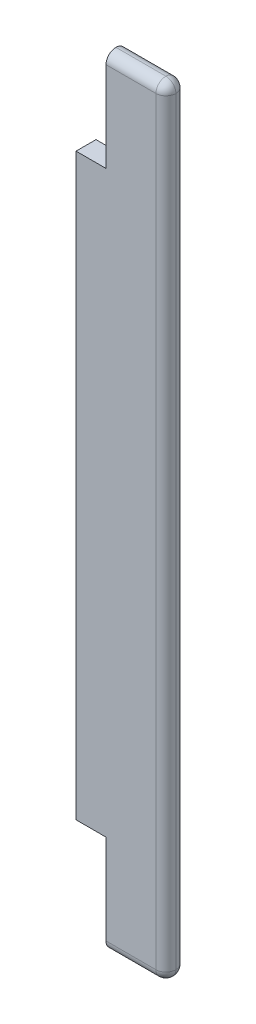
ISO-10303-21;
HEADER;
FILE_DESCRIPTION(('STEP AP214'),'2;1');
FILE_NAME('part.step','',(''),(''),'','','');
FILE_SCHEMA(('AUTOMOTIVE_DESIGN { 1 0 10303 214 1 1 1 1 }'));
ENDSEC;
DATA;
#1=APPLICATION_CONTEXT('core data for automotive mechanical design processes');
#2=APPLICATION_PROTOCOL_DEFINITION('international standard','automotive_design',2000,#1);
#3=PRODUCT_CONTEXT('',#1,'mechanical');
#4=PRODUCT('Part','Part','',(#3));
#5=PRODUCT_RELATED_PRODUCT_CATEGORY('part','',(#4));
#6=PRODUCT_DEFINITION_FORMATION('','',#4);
#7=PRODUCT_DEFINITION_CONTEXT('part definition',#1,'design');
#8=PRODUCT_DEFINITION('design','',#6,#7);
#9=PRODUCT_DEFINITION_SHAPE('','',#8);
#10=(LENGTH_UNIT() NAMED_UNIT(*) SI_UNIT(.MILLI.,.METRE.));
#11=(NAMED_UNIT(*) PLANE_ANGLE_UNIT() SI_UNIT($,.RADIAN.));
#12=(NAMED_UNIT(*) SI_UNIT($,.STERADIAN.) SOLID_ANGLE_UNIT());
#13=UNCERTAINTY_MEASURE_WITH_UNIT(LENGTH_MEASURE(1.E-05),#10,'distance_accuracy_value','');
#14=(GEOMETRIC_REPRESENTATION_CONTEXT(3) GLOBAL_UNCERTAINTY_ASSIGNED_CONTEXT((#13)) GLOBAL_UNIT_ASSIGNED_CONTEXT((#10,
#11,#12)) REPRESENTATION_CONTEXT('',''));
#15=CARTESIAN_POINT('',(0.,0.,0.));
#16=DIRECTION('',(0.,0.,1.));
#17=DIRECTION('',(1.,0.,0.));
#18=AXIS2_PLACEMENT_3D('',#15,#16,#17);
#19=CARTESIAN_POINT('',(-25.0000000000015,-120.172625831746,10.));
#20=DIRECTION('',(0.,1.,0.));
#21=DIRECTION('',(0.,0.,1.));
#22=AXIS2_PLACEMENT_3D('',#19,#20,#21);
#23=PLANE('',#22);
#24=DIRECTION('',(1.,0.,0.));
#25=VECTOR('',#24,1.);
#26=CARTESIAN_POINT('',(-25.0000000000015,-120.172625831746,0.));
#27=LINE('',#26,#25);
#28=CARTESIAN_POINT('',(-40.0000000000015,-120.172625831746,0.));
#29=VERTEX_POINT('',#28);
#30=CARTESIAN_POINT('',(-25.0000000000015,-120.172625831746,0.));
#31=VERTEX_POINT('',#30);
#32=EDGE_CURVE('E140',#29,#31,#27,.T.);
#33=ORIENTED_EDGE('',*,*,#32,.T.);
#34=DIRECTION('',(0.,0.,-1.));
#35=VECTOR('',#34,1.);
#36=CARTESIAN_POINT('',(-25.0000000000015,-120.172625831746,10.));
#37=LINE('',#36,#35);
#38=CARTESIAN_POINT('',(-25.0000000000015,-120.172625831746,10.));
#39=VERTEX_POINT('',#38);
#40=EDGE_CURVE('E120',#39,#31,#37,.T.);
#41=ORIENTED_EDGE('',*,*,#40,.F.);
#42=DIRECTION('',(1.,0.,0.));
#43=VECTOR('',#42,1.);
#44=CARTESIAN_POINT('',(-25.0000000000015,-120.172625831746,10.));
#45=LINE('',#44,#43);
#46=CARTESIAN_POINT('',(-40.0000000000015,-120.172625831746,10.));
#47=VERTEX_POINT('',#46);
#48=EDGE_CURVE('E127',#47,#39,#45,.T.);
#49=ORIENTED_EDGE('',*,*,#48,.F.);
#50=DIRECTION('',(0.,0.,-1.));
#51=VECTOR('',#50,1.);
#52=CARTESIAN_POINT('',(-40.0000000000015,-120.172625831746,10.));
#53=LINE('',#52,#51);
#54=EDGE_CURVE('E214',#47,#29,#53,.T.);
#55=ORIENTED_EDGE('',*,*,#54,.T.);
#56=EDGE_LOOP('',(#33,#41,#49,#55));
#57=FACE_BOUND('',#56,.T.);
#58=ADVANCED_FACE('F35',(#57),#23,.F.);
#59=CARTESIAN_POINT('',(-25.0000000000015,-170.172625831746,10.));
#60=DIRECTION('',(1.,0.,0.));
#61=DIRECTION('',(0.,0.,-1.));
#62=AXIS2_PLACEMENT_3D('',#59,#60,#61);
#63=PLANE('',#62);
#64=DIRECTION('',(0.,-1.,0.));
#65=VECTOR('',#64,1.);
#66=CARTESIAN_POINT('',(-25.0000000000015,-170.172625831746,0.));
#67=LINE('',#66,#65);
#68=CARTESIAN_POINT('',(-25.0000000000015,-165.172625831746,0.));
#69=VERTEX_POINT('',#68);
#70=EDGE_CURVE('E216',#31,#69,#67,.T.);
#71=ORIENTED_EDGE('',*,*,#70,.T.);
#72=CARTESIAN_POINT('',(-25.0000000000015,-165.172625831746,5.));
#73=DIRECTION('',(1.,0.,0.));
#74=DIRECTION('',(0.,0.,-1.));
#75=AXIS2_PLACEMENT_3D('',#72,#73,#74);
#76=CIRCLE('',#75,5.);
#77=CARTESIAN_POINT('',(-25.0000000000015,-170.172625831746,5.));
#78=VERTEX_POINT('',#77);
#79=EDGE_CURVE('E164',#69,#78,#76,.F.);
#80=ORIENTED_EDGE('',*,*,#79,.T.);
#81=CARTESIAN_POINT('',(-25.0000000000015,-165.172625831746,5.));
#82=DIRECTION('',(1.,0.,0.));
#83=DIRECTION('',(0.,0.,-1.));
#84=AXIS2_PLACEMENT_3D('',#81,#82,#83);
#85=CIRCLE('',#84,5.);
#86=CARTESIAN_POINT('',(-25.0000000000015,-165.172625831746,10.));
#87=VERTEX_POINT('',#86);
#88=EDGE_CURVE('E123',#78,#87,#85,.F.);
#89=ORIENTED_EDGE('',*,*,#88,.T.);
#90=DIRECTION('',(0.,-1.,0.));
#91=VECTOR('',#90,1.);
#92=CARTESIAN_POINT('',(-25.0000000000015,-170.172625831746,10.));
#93=LINE('',#92,#91);
#94=EDGE_CURVE('E115',#39,#87,#93,.T.);
#95=ORIENTED_EDGE('',*,*,#94,.F.);
#96=ORIENTED_EDGE('',*,*,#40,.T.);
#97=EDGE_LOOP('',(#71,#80,#89,#95,#96));
#98=FACE_BOUND('',#97,.T.);
#99=ADVANCED_FACE('F118',(#98),#63,.F.);
#100=CARTESIAN_POINT('',(-25.0000000000015,169.827374168254,10.));
#101=DIRECTION('',(1.,0.,0.));
#102=DIRECTION('',(0.,0.,-1.));
#103=AXIS2_PLACEMENT_3D('',#100,#101,#102);
#104=PLANE('',#103);
#105=CARTESIAN_POINT('',(-25.0000000000015,214.827374168254,5.));
#106=DIRECTION('',(1.,0.,0.));
#107=DIRECTION('',(0.,0.,-1.));
#108=AXIS2_PLACEMENT_3D('',#105,#106,#107);
#109=CIRCLE('',#108,5.);
#110=CARTESIAN_POINT('',(-25.0000000000015,214.827374168254,10.));
#111=VERTEX_POINT('',#110);
#112=CARTESIAN_POINT('',(-25.0000000000015,219.827374168254,5.));
#113=VERTEX_POINT('',#112);
#114=EDGE_CURVE('E53',#111,#113,#109,.F.);
#115=ORIENTED_EDGE('',*,*,#114,.T.);
#116=CARTESIAN_POINT('',(-25.0000000000015,214.827374168254,5.));
#117=DIRECTION('',(1.,0.,0.));
#118=DIRECTION('',(0.,0.,-1.));
#119=AXIS2_PLACEMENT_3D('',#116,#117,#118);
#120=CIRCLE('',#119,5.);
#121=CARTESIAN_POINT('',(-25.0000000000015,214.827374168254,0.));
#122=VERTEX_POINT('',#121);
#123=EDGE_CURVE('E185',#113,#122,#120,.F.);
#124=ORIENTED_EDGE('',*,*,#123,.T.);
#125=DIRECTION('',(0.,-1.,0.));
#126=VECTOR('',#125,1.);
#127=CARTESIAN_POINT('',(-25.0000000000015,169.827374168254,0.));
#128=LINE('',#127,#126);
#129=CARTESIAN_POINT('',(-25.0000000000015,169.827374168254,0.));
#130=VERTEX_POINT('',#129);
#131=EDGE_CURVE('E218',#122,#130,#128,.T.);
#132=ORIENTED_EDGE('',*,*,#131,.T.);
#133=DIRECTION('',(0.,0.,-1.));
#134=VECTOR('',#133,1.);
#135=CARTESIAN_POINT('',(-25.0000000000015,169.827374168254,10.));
#136=LINE('',#135,#134);
#137=CARTESIAN_POINT('',(-25.0000000000015,169.827374168254,10.));
#138=VERTEX_POINT('',#137);
#139=EDGE_CURVE('E142',#138,#130,#136,.T.);
#140=ORIENTED_EDGE('',*,*,#139,.F.);
#141=DIRECTION('',(0.,-1.,0.));
#142=VECTOR('',#141,1.);
#143=CARTESIAN_POINT('',(-25.0000000000015,169.827374168254,10.));
#144=LINE('',#143,#142);
#145=EDGE_CURVE('E126',#111,#138,#144,.T.);
#146=ORIENTED_EDGE('',*,*,#145,.F.);
#147=EDGE_LOOP('',(#115,#124,#132,#140,#146));
#148=FACE_BOUND('',#147,.T.);
#149=ADVANCED_FACE('F207',(#148),#104,.F.);
#150=CARTESIAN_POINT('',(-40.0000000000015,169.827374168254,10.));
#151=DIRECTION('',(0.,-1.,0.));
#152=DIRECTION('',(0.,0.,-1.));
#153=AXIS2_PLACEMENT_3D('',#150,#151,#152);
#154=PLANE('',#153);
#155=DIRECTION('',(-1.,0.,0.));
#156=VECTOR('',#155,1.);
#157=CARTESIAN_POINT('',(-40.0000000000015,169.827374168254,0.));
#158=LINE('',#157,#156);
#159=CARTESIAN_POINT('',(-40.0000000000015,169.827374168254,0.));
#160=VERTEX_POINT('',#159);
#161=EDGE_CURVE('E220',#130,#160,#158,.T.);
#162=ORIENTED_EDGE('',*,*,#161,.T.);
#163=DIRECTION('',(0.,0.,-1.));
#164=VECTOR('',#163,1.);
#165=CARTESIAN_POINT('',(-40.0000000000015,169.827374168254,10.));
#166=LINE('',#165,#164);
#167=CARTESIAN_POINT('',(-40.0000000000015,169.827374168254,10.));
#168=VERTEX_POINT('',#167);
#169=EDGE_CURVE('E147',#168,#160,#166,.T.);
#170=ORIENTED_EDGE('',*,*,#169,.F.);
#171=DIRECTION('',(-1.,0.,0.));
#172=VECTOR('',#171,1.);
#173=CARTESIAN_POINT('',(-40.0000000000015,169.827374168254,10.));
#174=LINE('',#173,#172);
#175=EDGE_CURVE('E209',#138,#168,#174,.T.);
#176=ORIENTED_EDGE('',*,*,#175,.F.);
#177=ORIENTED_EDGE('',*,*,#139,.T.);
#178=EDGE_LOOP('',(#162,#170,#176,#177));
#179=FACE_BOUND('',#178,.T.);
#180=ADVANCED_FACE('F284',(#179),#154,.F.);
#181=CARTESIAN_POINT('',(-40.0000000000015,-120.172625831746,10.));
#182=DIRECTION('',(1.,0.,0.));
#183=DIRECTION('',(0.,0.,-1.));
#184=AXIS2_PLACEMENT_3D('',#181,#182,#183);
#185=PLANE('',#184);
#186=DIRECTION('',(0.,-1.,0.));
#187=VECTOR('',#186,1.);
#188=CARTESIAN_POINT('',(-40.0000000000015,-120.172625831746,0.));
#189=LINE('',#188,#187);
#190=EDGE_CURVE('E137',#160,#29,#189,.T.);
#191=ORIENTED_EDGE('',*,*,#190,.T.);
#192=ORIENTED_EDGE('',*,*,#54,.F.);
#193=DIRECTION('',(0.,-1.,0.));
#194=VECTOR('',#193,1.);
#195=CARTESIAN_POINT('',(-40.0000000000015,-120.172625831746,10.));
#196=LINE('',#195,#194);
#197=EDGE_CURVE('E133',#168,#47,#196,.T.);
#198=ORIENTED_EDGE('',*,*,#197,.F.);
#199=ORIENTED_EDGE('',*,*,#169,.T.);
#200=EDGE_LOOP('',(#191,#192,#198,#199));
#201=FACE_BOUND('',#200,.T.);
#202=ADVANCED_FACE('F227',(#201),#185,.F.);
#203=CARTESIAN_POINT('',(0.,0.,10.));
#204=DIRECTION('',(0.,0.,-1.));
#205=DIRECTION('',(-1.,0.,0.));
#206=AXIS2_PLACEMENT_3D('',#203,#204,#205);
#207=PLANE('',#206);
#208=DIRECTION('',(0.,1.,0.));
#209=VECTOR('',#208,1.);
#210=CARTESIAN_POINT('',(-1.47278023110431E-12,0.,10.));
#211=LINE('',#210,#209);
#212=CARTESIAN_POINT('',(-1.47278023110431E-12,-165.172625831746,10.));
#213=VERTEX_POINT('',#212);
#214=CARTESIAN_POINT('',(-1.47278023110431E-12,214.827374168254,10.));
#215=VERTEX_POINT('',#214);
#216=EDGE_CURVE('E141',#213,#215,#211,.T.);
#217=ORIENTED_EDGE('',*,*,#216,.T.);
#218=DIRECTION('',(-1.,0.,0.));
#219=VECTOR('',#218,1.);
#220=CARTESIAN_POINT('',(0.,214.827374168254,10.));
#221=LINE('',#220,#219);
#222=EDGE_CURVE('E11',#215,#111,#221,.T.);
#223=ORIENTED_EDGE('',*,*,#222,.T.);
#224=ORIENTED_EDGE('',*,*,#145,.T.);
#225=ORIENTED_EDGE('',*,*,#175,.T.);
#226=ORIENTED_EDGE('',*,*,#197,.T.);
#227=ORIENTED_EDGE('',*,*,#48,.T.);
#228=ORIENTED_EDGE('',*,*,#94,.T.);
#229=DIRECTION('',(1.,0.,0.));
#230=VECTOR('',#229,1.);
#231=CARTESIAN_POINT('',(0.,-165.172625831746,10.));
#232=LINE('',#231,#230);
#233=EDGE_CURVE('E166',#87,#213,#232,.T.);
#234=ORIENTED_EDGE('',*,*,#233,.T.);
#235=EDGE_LOOP('',(#217,#223,#224,#225,#226,#227,#228,#234));
#236=FACE_BOUND('',#235,.T.);
#237=ADVANCED_FACE('F131',(#236),#207,.F.);
#238=CARTESIAN_POINT('',(0.,0.,0.));
#239=DIRECTION('',(0.,0.,-1.));
#240=DIRECTION('',(-1.,0.,0.));
#241=AXIS2_PLACEMENT_3D('',#238,#239,#240);
#242=PLANE('',#241);
#243=ORIENTED_EDGE('',*,*,#131,.F.);
#244=DIRECTION('',(-1.,0.,0.));
#245=VECTOR('',#244,1.);
#246=CARTESIAN_POINT('',(-1.47104550762833E-12,214.827374168254,0.));
#247=LINE('',#246,#245);
#248=CARTESIAN_POINT('',(-1.47278023110431E-12,214.827374168254,0.));
#249=VERTEX_POINT('',#248);
#250=EDGE_CURVE('E45',#122,#249,#247,.F.);
#251=ORIENTED_EDGE('',*,*,#250,.T.);
#252=DIRECTION('',(0.,1.,0.));
#253=VECTOR('',#252,1.);
#254=CARTESIAN_POINT('',(-1.47278023110431E-12,-170.172625831746,0.));
#255=LINE('',#254,#253);
#256=CARTESIAN_POINT('',(-1.47278023110431E-12,-165.172625831746,0.));
#257=VERTEX_POINT('',#256);
#258=EDGE_CURVE('E144',#249,#257,#255,.F.);
#259=ORIENTED_EDGE('',*,*,#258,.T.);
#260=DIRECTION('',(1.,0.,0.));
#261=VECTOR('',#260,1.);
#262=CARTESIAN_POINT('',(-25.0000000000015,-165.172625831746,0.));
#263=LINE('',#262,#261);
#264=EDGE_CURVE('E161',#257,#69,#263,.F.);
#265=ORIENTED_EDGE('',*,*,#264,.T.);
#266=ORIENTED_EDGE('',*,*,#70,.F.);
#267=ORIENTED_EDGE('',*,*,#32,.F.);
#268=ORIENTED_EDGE('',*,*,#190,.F.);
#269=ORIENTED_EDGE('',*,*,#161,.F.);
#270=EDGE_LOOP('',(#243,#251,#259,#265,#266,#267,#268,#269));
#271=FACE_BOUND('',#270,.T.);
#272=ADVANCED_FACE('F232',(#271),#242,.T.);
#273=CARTESIAN_POINT('',(-1.47278023110431E-12,0.,5.));
#274=DIRECTION('',(0.,1.,0.));
#275=DIRECTION('',(0.,0.,1.));
#276=AXIS2_PLACEMENT_3D('',#273,#274,#275);
#277=CYLINDRICAL_SURFACE('',#276,5.);
#278=DIRECTION('',(0.,1.,0.));
#279=VECTOR('',#278,1.);
#280=CARTESIAN_POINT('',(4.99999999999853,219.827374168254,5.));
#281=LINE('',#280,#279);
#282=CARTESIAN_POINT('',(4.99999999999853,214.827374168254,5.));
#283=VERTEX_POINT('',#282);
#284=CARTESIAN_POINT('',(4.99999999999853,-165.172625831746,5.));
#285=VERTEX_POINT('',#284);
#286=EDGE_CURVE('E153',#283,#285,#281,.F.);
#287=ORIENTED_EDGE('',*,*,#286,.F.);
#288=CARTESIAN_POINT('',(-1.47278023110431E-12,214.827374168254,5.));
#289=DIRECTION('',(0.,1.,0.));
#290=DIRECTION('',(0.,0.,1.));
#291=AXIS2_PLACEMENT_3D('',#288,#289,#290);
#292=CIRCLE('',#291,5.);
#293=EDGE_CURVE('E182',#283,#215,#292,.F.);
#294=ORIENTED_EDGE('',*,*,#293,.T.);
#295=ORIENTED_EDGE('',*,*,#216,.F.);
#296=CARTESIAN_POINT('',(-1.47278023110431E-12,-165.172625831746,5.));
#297=DIRECTION('',(0.,1.,0.));
#298=DIRECTION('',(0.,0.,1.));
#299=AXIS2_PLACEMENT_3D('',#296,#297,#298);
#300=CIRCLE('',#299,5.);
#301=EDGE_CURVE('E159',#213,#285,#300,.T.);
#302=ORIENTED_EDGE('',*,*,#301,.T.);
#303=EDGE_LOOP('',(#287,#294,#295,#302));
#304=FACE_BOUND('',#303,.T.);
#305=ADVANCED_FACE('F247',(#304),#277,.T.);
#306=CARTESIAN_POINT('',(-1.47278023110431E-12,219.827374168254,5.));
#307=DIRECTION('',(0.,-1.,0.));
#308=DIRECTION('',(0.,0.,-1.));
#309=AXIS2_PLACEMENT_3D('',#306,#307,#308);
#310=CYLINDRICAL_SURFACE('',#309,5.);
#311=ORIENTED_EDGE('',*,*,#258,.F.);
#312=CARTESIAN_POINT('',(-1.47278023110431E-12,214.827374168254,5.));
#313=DIRECTION('',(0.,-1.,0.));
#314=DIRECTION('',(0.,0.,-1.));
#315=AXIS2_PLACEMENT_3D('',#312,#313,#314);
#316=CIRCLE('',#315,5.);
#317=EDGE_CURVE('E168',#249,#283,#316,.T.);
#318=ORIENTED_EDGE('',*,*,#317,.T.);
#319=ORIENTED_EDGE('',*,*,#286,.T.);
#320=CARTESIAN_POINT('',(-1.47278023110431E-12,-165.172625831746,5.));
#321=DIRECTION('',(0.,-1.,0.));
#322=DIRECTION('',(0.,0.,-1.));
#323=AXIS2_PLACEMENT_3D('',#320,#321,#322);
#324=CIRCLE('',#323,5.);
#325=EDGE_CURVE('E152',#285,#257,#324,.F.);
#326=ORIENTED_EDGE('',*,*,#325,.T.);
#327=EDGE_LOOP('',(#311,#318,#319,#326));
#328=FACE_BOUND('',#327,.T.);
#329=ADVANCED_FACE('F251',(#328),#310,.T.);
#330=CARTESIAN_POINT('',(0.,-165.172625831746,5.));
#331=DIRECTION('',(1.,0.,0.));
#332=DIRECTION('',(0.,0.,-1.));
#333=AXIS2_PLACEMENT_3D('',#330,#331,#332);
#334=CYLINDRICAL_SURFACE('',#333,5.);
#335=ORIENTED_EDGE('',*,*,#233,.F.);
#336=ORIENTED_EDGE('',*,*,#88,.F.);
#337=DIRECTION('',(1.,0.,0.));
#338=VECTOR('',#337,1.);
#339=CARTESIAN_POINT('',(4.99999999999853,-170.172625831746,5.));
#340=LINE('',#339,#338);
#341=CARTESIAN_POINT('',(-1.47278023110431E-12,-170.172625831746,5.));
#342=VERTEX_POINT('',#341);
#343=EDGE_CURVE('E156',#342,#78,#340,.F.);
#344=ORIENTED_EDGE('',*,*,#343,.F.);
#345=CARTESIAN_POINT('',(-1.47278023110431E-12,-165.172625831746,5.));
#346=DIRECTION('',(1.,0.,0.));
#347=DIRECTION('',(0.,0.,-1.));
#348=AXIS2_PLACEMENT_3D('',#345,#346,#347);
#349=CIRCLE('',#348,5.);
#350=EDGE_CURVE('E175',#213,#342,#349,.T.);
#351=ORIENTED_EDGE('',*,*,#350,.F.);
#352=EDGE_LOOP('',(#335,#336,#344,#351));
#353=FACE_BOUND('',#352,.T.);
#354=ADVANCED_FACE('F240',(#353),#334,.T.);
#355=CARTESIAN_POINT('',(4.99999999999853,-165.172625831746,5.));
#356=DIRECTION('',(-1.,0.,0.));
#357=DIRECTION('',(0.,0.,1.));
#358=AXIS2_PLACEMENT_3D('',#355,#356,#357);
#359=CYLINDRICAL_SURFACE('',#358,5.);
#360=ORIENTED_EDGE('',*,*,#79,.F.);
#361=ORIENTED_EDGE('',*,*,#264,.F.);
#362=CARTESIAN_POINT('',(-1.47278023110431E-12,-165.172625831746,5.));
#363=DIRECTION('',(1.,0.,0.));
#364=DIRECTION('',(0.,0.,-1.));
#365=AXIS2_PLACEMENT_3D('',#362,#363,#364);
#366=CIRCLE('',#365,5.);
#367=EDGE_CURVE('E172',#342,#257,#366,.T.);
#368=ORIENTED_EDGE('',*,*,#367,.F.);
#369=ORIENTED_EDGE('',*,*,#343,.T.);
#370=EDGE_LOOP('',(#360,#361,#368,#369));
#371=FACE_BOUND('',#370,.T.);
#372=ADVANCED_FACE('F236',(#371),#359,.T.);
#373=CARTESIAN_POINT('',(-1.47278023110431E-12,-165.172625831746,5.));
#374=DIRECTION('',(0.,0.,1.));
#375=DIRECTION('',(1.,0.,0.));
#376=AXIS2_PLACEMENT_3D('',#373,#374,#375);
#377=SPHERICAL_SURFACE('',#376,5.);
#378=ORIENTED_EDGE('',*,*,#301,.F.);
#379=ORIENTED_EDGE('',*,*,#350,.T.);
#380=CARTESIAN_POINT('',(-1.47278023110431E-12,-165.172625831746,5.));
#381=DIRECTION('',(0.,0.,-1.));
#382=DIRECTION('',(-1.,0.,0.));
#383=AXIS2_PLACEMENT_3D('',#380,#381,#382);
#384=CIRCLE('',#383,5.);
#385=EDGE_CURVE('E169',#285,#342,#384,.T.);
#386=ORIENTED_EDGE('',*,*,#385,.F.);
#387=EDGE_LOOP('',(#378,#379,#386));
#388=FACE_BOUND('',#387,.T.);
#389=ADVANCED_FACE('F244',(#388),#377,.T.);
#390=CARTESIAN_POINT('',(-1.47278023110431E-12,-165.172625831746,5.));
#391=DIRECTION('',(0.,0.,1.));
#392=DIRECTION('',(1.,0.,0.));
#393=AXIS2_PLACEMENT_3D('',#390,#391,#392);
#394=SPHERICAL_SURFACE('',#393,5.);
#395=ORIENTED_EDGE('',*,*,#367,.T.);
#396=ORIENTED_EDGE('',*,*,#325,.F.);
#397=ORIENTED_EDGE('',*,*,#385,.T.);
#398=EDGE_LOOP('',(#395,#396,#397));
#399=FACE_BOUND('',#398,.T.);
#400=ADVANCED_FACE('F254',(#399),#394,.T.);
#401=CARTESIAN_POINT('',(0.,214.827374168254,5.));
#402=DIRECTION('',(-1.,0.,0.));
#403=DIRECTION('',(0.,0.,1.));
#404=AXIS2_PLACEMENT_3D('',#401,#402,#403);
#405=CYLINDRICAL_SURFACE('',#404,5.);
#406=ORIENTED_EDGE('',*,*,#114,.F.);
#407=ORIENTED_EDGE('',*,*,#222,.F.);
#408=CARTESIAN_POINT('',(-1.47104550762833E-12,214.827374168254,5.));
#409=DIRECTION('',(1.,0.,0.));
#410=DIRECTION('',(0.,0.,-1.));
#411=AXIS2_PLACEMENT_3D('',#408,#409,#410);
#412=CIRCLE('',#411,5.);
#413=CARTESIAN_POINT('',(-1.47104550762833E-12,219.827374168254,5.));
#414=VERTEX_POINT('',#413);
#415=EDGE_CURVE('E39',#414,#215,#412,.T.);
#416=ORIENTED_EDGE('',*,*,#415,.F.);
#417=DIRECTION('',(-1.,0.,0.));
#418=VECTOR('',#417,1.);
#419=CARTESIAN_POINT('',(-25.0000000000015,219.827374168254,5.));
#420=LINE('',#419,#418);
#421=EDGE_CURVE('E192',#113,#414,#420,.F.);
#422=ORIENTED_EDGE('',*,*,#421,.F.);
#423=EDGE_LOOP('',(#406,#407,#416,#422));
#424=FACE_BOUND('',#423,.T.);
#425=ADVANCED_FACE('F37',(#424),#405,.T.);
#426=CARTESIAN_POINT('',(-1.47191286936632E-12,214.827374168254,5.));
#427=DIRECTION('',(0.,0.,1.));
#428=DIRECTION('',(1.,0.,0.));
#429=AXIS2_PLACEMENT_3D('',#426,#427,#428);
#430=SPHERICAL_SURFACE('',#429,5.);
#431=ORIENTED_EDGE('',*,*,#415,.T.);
#432=ORIENTED_EDGE('',*,*,#293,.F.);
#433=CARTESIAN_POINT('',(-1.47104550762833E-12,214.827374168254,5.));
#434=DIRECTION('',(0.,0.,-1.));
#435=DIRECTION('',(-1.,0.,0.));
#436=AXIS2_PLACEMENT_3D('',#433,#434,#435);
#437=CIRCLE('',#436,5.);
#438=EDGE_CURVE('E191',#414,#283,#437,.T.);
#439=ORIENTED_EDGE('',*,*,#438,.F.);
#440=EDGE_LOOP('',(#431,#432,#439));
#441=FACE_BOUND('',#440,.T.);
#442=ADVANCED_FACE('F202',(#441),#430,.T.);
#443=CARTESIAN_POINT('',(-25.0000000000015,214.827374168254,5.));
#444=DIRECTION('',(1.,0.,0.));
#445=DIRECTION('',(0.,0.,-1.));
#446=AXIS2_PLACEMENT_3D('',#443,#444,#445);
#447=CYLINDRICAL_SURFACE('',#446,5.);
#448=ORIENTED_EDGE('',*,*,#123,.F.);
#449=ORIENTED_EDGE('',*,*,#421,.T.);
#450=CARTESIAN_POINT('',(-1.47278023110431E-12,214.827374168254,5.));
#451=DIRECTION('',(1.,0.,0.));
#452=DIRECTION('',(0.,1.,0.));
#453=AXIS2_PLACEMENT_3D('',#450,#451,#452);
#454=CIRCLE('',#453,5.);
#455=EDGE_CURVE('E188',#249,#414,#454,.T.);
#456=ORIENTED_EDGE('',*,*,#455,.F.);
#457=ORIENTED_EDGE('',*,*,#250,.F.);
#458=EDGE_LOOP('',(#448,#449,#456,#457));
#459=FACE_BOUND('',#458,.T.);
#460=ADVANCED_FACE('F335',(#459),#447,.T.);
#461=CARTESIAN_POINT('',(-1.47191286936632E-12,214.827374168254,5.));
#462=DIRECTION('',(0.,0.,1.));
#463=DIRECTION('',(1.,0.,0.));
#464=AXIS2_PLACEMENT_3D('',#461,#462,#463);
#465=SPHERICAL_SURFACE('',#464,5.);
#466=ORIENTED_EDGE('',*,*,#455,.T.);
#467=ORIENTED_EDGE('',*,*,#438,.T.);
#468=ORIENTED_EDGE('',*,*,#317,.F.);
#469=EDGE_LOOP('',(#466,#467,#468));
#470=FACE_BOUND('',#469,.T.);
#471=ADVANCED_FACE('F344',(#470),#465,.T.);
#472=CLOSED_SHELL('',(#58,#99,#149,#180,#202,#237,#272,#305,#329,#354,#372,#389,#400,#425,#442,
#460,#471));
#473=MANIFOLD_SOLID_BREP('B2',#472);
#474=ADVANCED_BREP_SHAPE_REPRESENTATION('',(#18,#473),#14);
#475=SHAPE_DEFINITION_REPRESENTATION(#9,#474);
ENDSEC;
END-ISO-10303-21;
